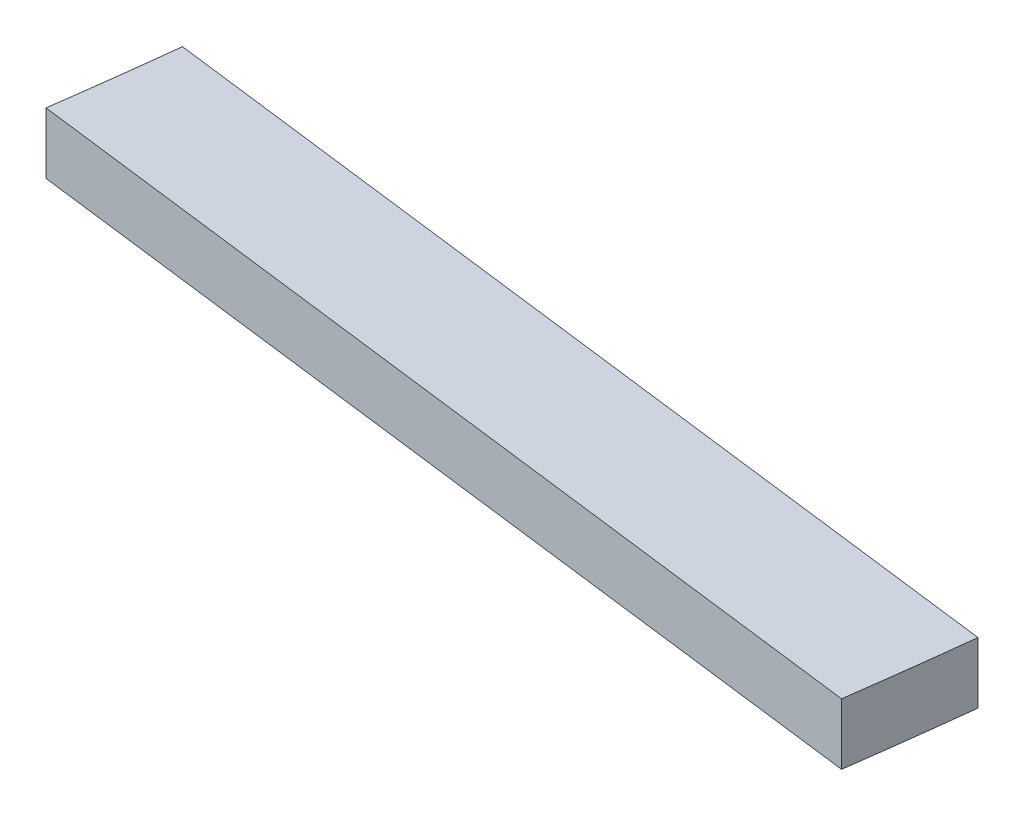
ISO-10303-21;
HEADER;
FILE_DESCRIPTION(('STEP AP214'),'2;1');
FILE_NAME('part.step','',(''),(''),'','','');
FILE_SCHEMA(('AUTOMOTIVE_DESIGN { 1 0 10303 214 1 1 1 1 }'));
ENDSEC;
DATA;
#1=APPLICATION_CONTEXT('core data for automotive mechanical design processes');
#2=APPLICATION_PROTOCOL_DEFINITION('international standard','automotive_design',2000,#1);
#3=PRODUCT_CONTEXT('',#1,'mechanical');
#4=PRODUCT('Part','Part','',(#3));
#5=PRODUCT_RELATED_PRODUCT_CATEGORY('part','',(#4));
#6=PRODUCT_DEFINITION_FORMATION('','',#4);
#7=PRODUCT_DEFINITION_CONTEXT('part definition',#1,'design');
#8=PRODUCT_DEFINITION('design','',#6,#7);
#9=PRODUCT_DEFINITION_SHAPE('','',#8);
#10=(LENGTH_UNIT() NAMED_UNIT(*) SI_UNIT(.MILLI.,.METRE.));
#11=(NAMED_UNIT(*) PLANE_ANGLE_UNIT() SI_UNIT($,.RADIAN.));
#12=(NAMED_UNIT(*) SI_UNIT($,.STERADIAN.) SOLID_ANGLE_UNIT());
#13=UNCERTAINTY_MEASURE_WITH_UNIT(LENGTH_MEASURE(1.E-05),#10,'distance_accuracy_value','');
#14=(GEOMETRIC_REPRESENTATION_CONTEXT(3) GLOBAL_UNCERTAINTY_ASSIGNED_CONTEXT((#13)) GLOBAL_UNIT_ASSIGNED_CONTEXT((#10,
#11,#12)) REPRESENTATION_CONTEXT('',''));
#15=CARTESIAN_POINT('',(0.,0.,0.));
#16=DIRECTION('',(0.,0.,1.));
#17=DIRECTION('',(1.,0.,0.));
#18=AXIS2_PLACEMENT_3D('',#15,#16,#17);
#19=CARTESIAN_POINT('',(-6.38263258398625E-13,7.62,-2.72501608392713E-13));
#20=DIRECTION('',(0.,1.,0.));
#21=DIRECTION('',(0.,0.,1.));
#22=AXIS2_PLACEMENT_3D('',#19,#20,#21);
#23=PLANE('',#22);
#24=DIRECTION('',(-0.992239206600172,0.,-0.124343704647488));
#25=VECTOR('',#24,1.);
#26=CARTESIAN_POINT('',(17.823995774707,7.62,2.48962311690169));
#27=LINE('',#26,#25);
#28=CARTESIAN_POINT('',(21.6047379194246,7.62,2.96341157583779));
#29=VERTEX_POINT('',#28);
#30=CARTESIAN_POINT('',(17.823995774707,7.62,2.48962311690169));
#31=VERTEX_POINT('',#30);
#32=EDGE_CURVE('E59',#29,#31,#27,.T.);
#33=ORIENTED_EDGE('',*,*,#32,.T.);
#34=CARTESIAN_POINT('',(-6.38263258398625E-13,7.62,-2.72501608392713E-13));
#35=DIRECTION('',(0.,1.,0.));
#36=DIRECTION('',(0.,0.,1.));
#37=AXIS2_PLACEMENT_3D('',#34,#35,#36);
#38=CIRCLE('',#37,17.9970288837076);
#39=CARTESIAN_POINT('',(17.8871623766678,7.62,1.98556559994879));
#40=VERTEX_POINT('',#39);
#41=EDGE_CURVE('E81',#31,#40,#38,.T.);
#42=ORIENTED_EDGE('',*,*,#41,.T.);
#43=DIRECTION('',(0.992239206600172,0.,0.124343704647487));
#44=VECTOR('',#43,1.);
#45=CARTESIAN_POINT('',(17.8871623766679,7.62,1.9855655999488));
#46=LINE('',#45,#44);
#47=CARTESIAN_POINT('',(21.6679045213855,7.62,2.4593540588849));
#48=VERTEX_POINT('',#47);
#49=EDGE_CURVE('E60',#40,#48,#46,.T.);
#50=ORIENTED_EDGE('',*,*,#49,.T.);
#51=CARTESIAN_POINT('',(-6.38263258398625E-13,7.62,-2.72501608392713E-13));
#52=DIRECTION('',(0.,1.,0.));
#53=DIRECTION('',(0.,0.,1.));
#54=AXIS2_PLACEMENT_3D('',#51,#52,#53);
#55=CIRCLE('',#54,21.8070288837077);
#56=EDGE_CURVE('E20',#29,#48,#55,.T.);
#57=ORIENTED_EDGE('',*,*,#56,.F.);
#58=EDGE_LOOP('',(#33,#42,#50,#57));
#59=FACE_BOUND('',#58,.T.);
#60=ADVANCED_FACE('F17',(#59),#23,.F.);
#61=CARTESIAN_POINT('',(-6.38263258398625E-13,7.874,-2.72501608392713E-13));
#62=DIRECTION('',(0.,1.,0.));
#63=DIRECTION('',(0.,0.,1.));
#64=AXIS2_PLACEMENT_3D('',#61,#62,#63);
#65=CYLINDRICAL_SURFACE('',#64,21.8070288837077);
#66=CARTESIAN_POINT('',(-6.38263258398625E-13,7.874,-2.72501608392713E-13));
#67=DIRECTION('',(0.,1.,0.));
#68=DIRECTION('',(0.,0.,1.));
#69=AXIS2_PLACEMENT_3D('',#66,#67,#68);
#70=CIRCLE('',#69,21.8070288837077);
#71=CARTESIAN_POINT('',(21.6047379194246,7.874,2.96341157583779));
#72=VERTEX_POINT('',#71);
#73=CARTESIAN_POINT('',(21.6679045213855,7.874,2.4593540588849));
#74=VERTEX_POINT('',#73);
#75=EDGE_CURVE('E68',#72,#74,#70,.T.);
#76=ORIENTED_EDGE('',*,*,#75,.F.);
#77=DIRECTION('',(0.,1.,0.));
#78=VECTOR('',#77,1.);
#79=CARTESIAN_POINT('',(21.6047379194245,7.874,2.96341157583778));
#80=LINE('',#79,#78);
#81=EDGE_CURVE('E65',#72,#29,#80,.F.);
#82=ORIENTED_EDGE('',*,*,#81,.T.);
#83=ORIENTED_EDGE('',*,*,#56,.T.);
#84=DIRECTION('',(0.,1.,0.));
#85=VECTOR('',#84,1.);
#86=CARTESIAN_POINT('',(21.6679045213855,7.874,2.4593540588849));
#87=LINE('',#86,#85);
#88=EDGE_CURVE('E63',#48,#74,#87,.T.);
#89=ORIENTED_EDGE('',*,*,#88,.T.);
#90=EDGE_LOOP('',(#76,#82,#83,#89));
#91=FACE_BOUND('',#90,.T.);
#92=ADVANCED_FACE('F66',(#91),#65,.T.);
#93=CARTESIAN_POINT('',(17.8871623766679,7.874,1.9855655999488));
#94=DIRECTION('',(-0.124343704647487,0.,0.992239206600172));
#95=DIRECTION('',(0.992239206600172,0.,0.124343704647487));
#96=AXIS2_PLACEMENT_3D('',#93,#94,#95);
#97=PLANE('',#96);
#98=DIRECTION('',(0.,1.,0.));
#99=VECTOR('',#98,1.);
#100=CARTESIAN_POINT('',(17.8871623766678,7.874,1.98556559994879));
#101=LINE('',#100,#99);
#102=CARTESIAN_POINT('',(17.8871623766678,7.874,1.98556559994879));
#103=VERTEX_POINT('',#102);
#104=EDGE_CURVE('E79',#40,#103,#101,.T.);
#105=ORIENTED_EDGE('',*,*,#104,.T.);
#106=DIRECTION('',(-0.992239206600172,0.,-0.124343704647488));
#107=VECTOR('',#106,1.);
#108=CARTESIAN_POINT('',(21.6679045213855,7.874,2.4593540588849));
#109=LINE('',#108,#107);
#110=EDGE_CURVE('E73',#74,#103,#109,.T.);
#111=ORIENTED_EDGE('',*,*,#110,.F.);
#112=ORIENTED_EDGE('',*,*,#88,.F.);
#113=ORIENTED_EDGE('',*,*,#49,.F.);
#114=EDGE_LOOP('',(#105,#111,#112,#113));
#115=FACE_BOUND('',#114,.T.);
#116=ADVANCED_FACE('F90',(#115),#97,.F.);
#117=CARTESIAN_POINT('',(-6.38263258398625E-13,7.874,-2.72501608392713E-13));
#118=DIRECTION('',(0.,1.,0.));
#119=DIRECTION('',(0.,0.,1.));
#120=AXIS2_PLACEMENT_3D('',#117,#118,#119);
#121=CYLINDRICAL_SURFACE('',#120,17.9970288837076);
#122=DIRECTION('',(0.,1.,0.));
#123=VECTOR('',#122,1.);
#124=CARTESIAN_POINT('',(17.823995774707,7.874,2.48962311690169));
#125=LINE('',#124,#123);
#126=CARTESIAN_POINT('',(17.823995774707,7.874,2.48962311690168));
#127=VERTEX_POINT('',#126);
#128=EDGE_CURVE('E35',#31,#127,#125,.T.);
#129=ORIENTED_EDGE('',*,*,#128,.T.);
#130=CARTESIAN_POINT('',(-6.38263258398625E-13,7.874,-2.72501608392713E-13));
#131=DIRECTION('',(0.,1.,0.));
#132=DIRECTION('',(0.,0.,1.));
#133=AXIS2_PLACEMENT_3D('',#130,#131,#132);
#134=CIRCLE('',#133,17.9970288837076);
#135=EDGE_CURVE('E26',#103,#127,#134,.F.);
#136=ORIENTED_EDGE('',*,*,#135,.F.);
#137=ORIENTED_EDGE('',*,*,#104,.F.);
#138=ORIENTED_EDGE('',*,*,#41,.F.);
#139=EDGE_LOOP('',(#129,#136,#137,#138));
#140=FACE_BOUND('',#139,.T.);
#141=ADVANCED_FACE('F92',(#140),#121,.F.);
#142=CARTESIAN_POINT('',(17.823995774707,7.874,2.48962311690169));
#143=DIRECTION('',(0.124343704647488,0.,-0.992239206600172));
#144=DIRECTION('',(-0.992239206600172,0.,-0.124343704647488));
#145=AXIS2_PLACEMENT_3D('',#142,#143,#144);
#146=PLANE('',#145);
#147=ORIENTED_EDGE('',*,*,#81,.F.);
#148=DIRECTION('',(0.992239206600172,0.,0.124343704647491));
#149=VECTOR('',#148,1.);
#150=CARTESIAN_POINT('',(17.823995774707,7.874,2.48962311690168));
#151=LINE('',#150,#149);
#152=EDGE_CURVE('E11',#127,#72,#151,.T.);
#153=ORIENTED_EDGE('',*,*,#152,.F.);
#154=ORIENTED_EDGE('',*,*,#128,.F.);
#155=ORIENTED_EDGE('',*,*,#32,.F.);
#156=EDGE_LOOP('',(#147,#153,#154,#155));
#157=FACE_BOUND('',#156,.T.);
#158=ADVANCED_FACE('F71',(#157),#146,.F.);
#159=CARTESIAN_POINT('',(-6.38263258398625E-13,7.874,-2.72501608392713E-13));
#160=DIRECTION('',(0.,1.,0.));
#161=DIRECTION('',(0.,0.,1.));
#162=AXIS2_PLACEMENT_3D('',#159,#160,#161);
#163=PLANE('',#162);
#164=ORIENTED_EDGE('',*,*,#135,.T.);
#165=ORIENTED_EDGE('',*,*,#152,.T.);
#166=ORIENTED_EDGE('',*,*,#75,.T.);
#167=ORIENTED_EDGE('',*,*,#110,.T.);
#168=EDGE_LOOP('',(#164,#165,#166,#167));
#169=FACE_BOUND('',#168,.T.);
#170=ADVANCED_FACE('F89',(#169),#163,.T.);
#171=CLOSED_SHELL('',(#60,#92,#116,#141,#158,#170));
#172=MANIFOLD_SOLID_BREP('B1',#171);
#173=ADVANCED_BREP_SHAPE_REPRESENTATION('',(#18,#172),#14);
#174=SHAPE_DEFINITION_REPRESENTATION(#9,#173);
ENDSEC;
END-ISO-10303-21;
